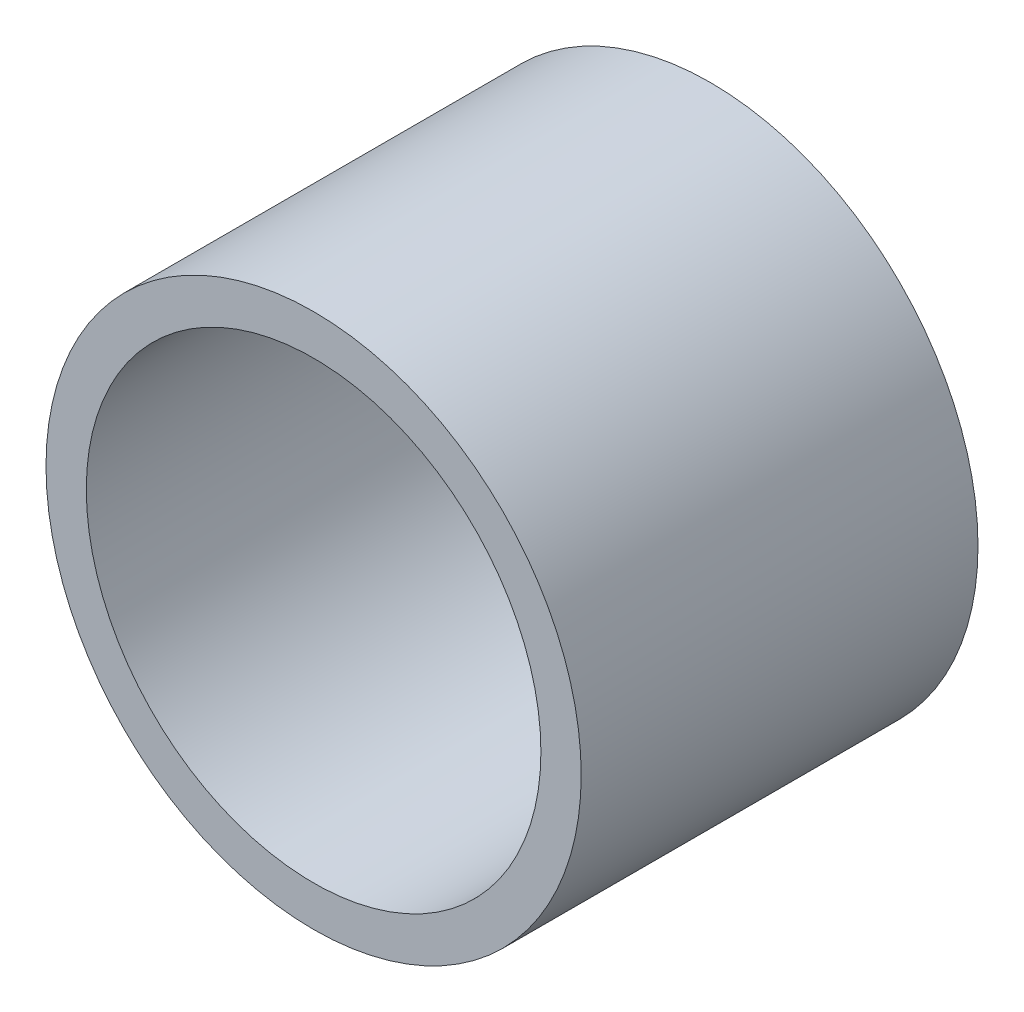
ISO-10303-21;
HEADER;
FILE_DESCRIPTION(('STEP AP214'),'2;1');
FILE_NAME('part.step','',(''),(''),'','','');
FILE_SCHEMA(('AUTOMOTIVE_DESIGN { 1 0 10303 214 1 1 1 1 }'));
ENDSEC;
DATA;
#1=APPLICATION_CONTEXT('core data for automotive mechanical design processes');
#2=APPLICATION_PROTOCOL_DEFINITION('international standard','automotive_design',2000,#1);
#3=PRODUCT_CONTEXT('',#1,'mechanical');
#4=PRODUCT('Part','Part','',(#3));
#5=PRODUCT_RELATED_PRODUCT_CATEGORY('part','',(#4));
#6=PRODUCT_DEFINITION_FORMATION('','',#4);
#7=PRODUCT_DEFINITION_CONTEXT('part definition',#1,'design');
#8=PRODUCT_DEFINITION('design','',#6,#7);
#9=PRODUCT_DEFINITION_SHAPE('','',#8);
#10=(LENGTH_UNIT() NAMED_UNIT(*) SI_UNIT(.MILLI.,.METRE.));
#11=(NAMED_UNIT(*) PLANE_ANGLE_UNIT() SI_UNIT($,.RADIAN.));
#12=(NAMED_UNIT(*) SI_UNIT($,.STERADIAN.) SOLID_ANGLE_UNIT());
#13=UNCERTAINTY_MEASURE_WITH_UNIT(LENGTH_MEASURE(1.E-05),#10,'distance_accuracy_value','');
#14=(GEOMETRIC_REPRESENTATION_CONTEXT(3) GLOBAL_UNCERTAINTY_ASSIGNED_CONTEXT((#13)) GLOBAL_UNIT_ASSIGNED_CONTEXT((#10,
#11,#12)) REPRESENTATION_CONTEXT('',''));
#15=CARTESIAN_POINT('',(0.,0.,0.));
#16=DIRECTION('',(0.,0.,1.));
#17=DIRECTION('',(1.,0.,0.));
#18=AXIS2_PLACEMENT_3D('',#15,#16,#17);
#19=CARTESIAN_POINT('',(0.,0.,48.006));
#20=DIRECTION('',(0.,0.,1.));
#21=DIRECTION('',(1.,0.,0.));
#22=AXIS2_PLACEMENT_3D('',#19,#20,#21);
#23=PLANE('',#22);
#24=CARTESIAN_POINT('',(0.,0.,48.006));
#25=DIRECTION('',(0.,0.,1.));
#26=DIRECTION('',(1.,0.,0.));
#27=AXIS2_PLACEMENT_3D('',#24,#25,#26);
#28=CIRCLE('',#27,32.375);
#29=CARTESIAN_POINT('',(32.375,0.,48.006));
#30=VERTEX_POINT('',#29);
#31=EDGE_CURVE('E10',#30,#30,#28,.T.);
#32=ORIENTED_EDGE('',*,*,#31,.T.);
#33=EDGE_LOOP('',(#32));
#34=FACE_BOUND('',#33,.T.);
#35=CARTESIAN_POINT('',(0.,0.,48.006));
#36=DIRECTION('',(0.,0.,1.));
#37=DIRECTION('',(1.,0.,0.));
#38=AXIS2_PLACEMENT_3D('',#35,#36,#37);
#39=CIRCLE('',#38,27.5);
#40=CARTESIAN_POINT('',(27.5,0.,48.006));
#41=VERTEX_POINT('',#40);
#42=EDGE_CURVE('E43',#41,#41,#39,.T.);
#43=ORIENTED_EDGE('',*,*,#42,.F.);
#44=EDGE_LOOP('',(#43));
#45=FACE_BOUND('',#44,.T.);
#46=ADVANCED_FACE('F32',(#34,#45),#23,.T.);
#47=CARTESIAN_POINT('',(0.,0.,0.));
#48=DIRECTION('',(0.,0.,1.));
#49=DIRECTION('',(1.,0.,0.));
#50=AXIS2_PLACEMENT_3D('',#47,#48,#49);
#51=PLANE('',#50);
#52=CARTESIAN_POINT('',(0.,0.,0.));
#53=DIRECTION('',(0.,0.,1.));
#54=DIRECTION('',(1.,0.,0.));
#55=AXIS2_PLACEMENT_3D('',#52,#53,#54);
#56=CIRCLE('',#55,32.375);
#57=CARTESIAN_POINT('',(32.375,0.,0.));
#58=VERTEX_POINT('',#57);
#59=EDGE_CURVE('E36',#58,#58,#56,.T.);
#60=ORIENTED_EDGE('',*,*,#59,.F.);
#61=EDGE_LOOP('',(#60));
#62=FACE_BOUND('',#61,.T.);
#63=CARTESIAN_POINT('',(0.,0.,0.));
#64=DIRECTION('',(0.,0.,1.));
#65=DIRECTION('',(1.,0.,0.));
#66=AXIS2_PLACEMENT_3D('',#63,#64,#65);
#67=CIRCLE('',#66,27.5);
#68=CARTESIAN_POINT('',(27.5,0.,0.));
#69=VERTEX_POINT('',#68);
#70=EDGE_CURVE('E45',#69,#69,#67,.T.);
#71=ORIENTED_EDGE('',*,*,#70,.T.);
#72=EDGE_LOOP('',(#71));
#73=FACE_BOUND('',#72,.T.);
#74=ADVANCED_FACE('F55',(#62,#73),#51,.F.);
#75=CARTESIAN_POINT('',(0.,0.,48.006));
#76=DIRECTION('',(0.,0.,-1.));
#77=DIRECTION('',(-1.,0.,0.));
#78=AXIS2_PLACEMENT_3D('',#75,#76,#77);
#79=CYLINDRICAL_SURFACE('',#78,32.375);
#80=ORIENTED_EDGE('',*,*,#31,.F.);
#81=EDGE_LOOP('',(#80));
#82=FACE_BOUND('',#81,.T.);
#83=ORIENTED_EDGE('',*,*,#59,.T.);
#84=EDGE_LOOP('',(#83));
#85=FACE_BOUND('',#84,.T.);
#86=ADVANCED_FACE('F34',(#82,#85),#79,.T.);
#87=CARTESIAN_POINT('',(0.,0.,48.006));
#88=DIRECTION('',(0.,0.,-1.));
#89=DIRECTION('',(-1.,0.,0.));
#90=AXIS2_PLACEMENT_3D('',#87,#88,#89);
#91=CYLINDRICAL_SURFACE('',#90,27.5);
#92=ORIENTED_EDGE('',*,*,#42,.T.);
#93=EDGE_LOOP('',(#92));
#94=FACE_BOUND('',#93,.T.);
#95=ORIENTED_EDGE('',*,*,#70,.F.);
#96=EDGE_LOOP('',(#95));
#97=FACE_BOUND('',#96,.T.);
#98=ADVANCED_FACE('F51',(#94,#97),#91,.F.);
#99=CLOSED_SHELL('',(#46,#74,#86,#98));
#100=MANIFOLD_SOLID_BREP('B2',#99);
#101=ADVANCED_BREP_SHAPE_REPRESENTATION('',(#18,#100),#14);
#102=SHAPE_DEFINITION_REPRESENTATION(#9,#101);
ENDSEC;
END-ISO-10303-21;
